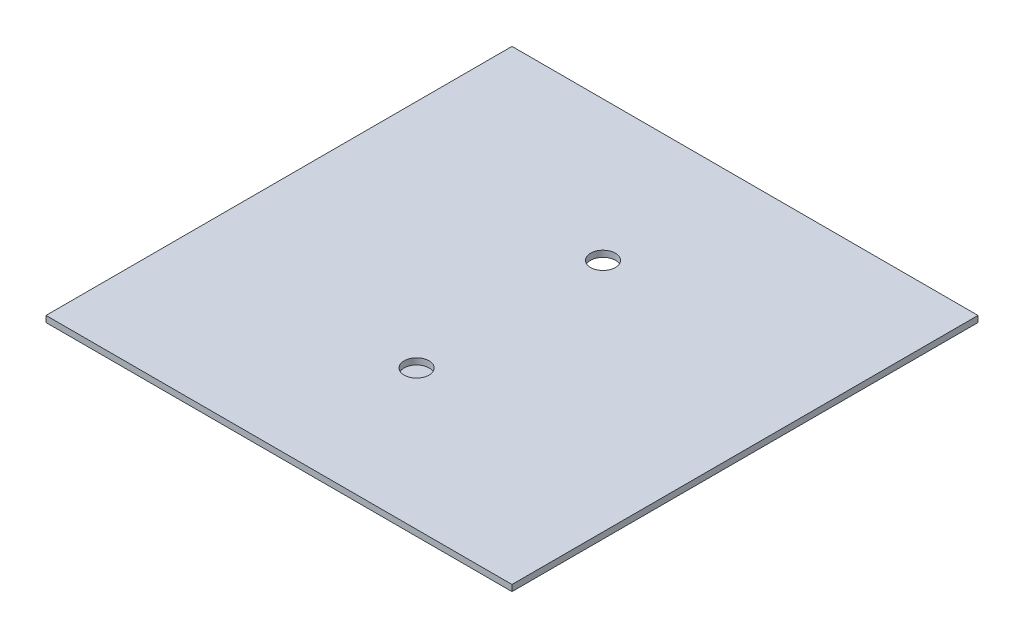
ISO-10303-21;
HEADER;
FILE_DESCRIPTION(('STEP AP214'),'2;1');
FILE_NAME('part.step','',(''),(''),'','','');
FILE_SCHEMA(('AUTOMOTIVE_DESIGN { 1 0 10303 214 1 1 1 1 }'));
ENDSEC;
DATA;
#1=APPLICATION_CONTEXT('core data for automotive mechanical design processes');
#2=APPLICATION_PROTOCOL_DEFINITION('international standard','automotive_design',2000,#1);
#3=PRODUCT_CONTEXT('',#1,'mechanical');
#4=PRODUCT('Part','Part','',(#3));
#5=PRODUCT_RELATED_PRODUCT_CATEGORY('part','',(#4));
#6=PRODUCT_DEFINITION_FORMATION('','',#4);
#7=PRODUCT_DEFINITION_CONTEXT('part definition',#1,'design');
#8=PRODUCT_DEFINITION('design','',#6,#7);
#9=PRODUCT_DEFINITION_SHAPE('','',#8);
#10=(LENGTH_UNIT() NAMED_UNIT(*) SI_UNIT(.MILLI.,.METRE.));
#11=(NAMED_UNIT(*) PLANE_ANGLE_UNIT() SI_UNIT($,.RADIAN.));
#12=(NAMED_UNIT(*) SI_UNIT($,.STERADIAN.) SOLID_ANGLE_UNIT());
#13=UNCERTAINTY_MEASURE_WITH_UNIT(LENGTH_MEASURE(1.E-05),#10,'distance_accuracy_value','');
#14=(GEOMETRIC_REPRESENTATION_CONTEXT(3) GLOBAL_UNCERTAINTY_ASSIGNED_CONTEXT((#13)) GLOBAL_UNIT_ASSIGNED_CONTEXT((#10,
#11,#12)) REPRESENTATION_CONTEXT('',''));
#15=CARTESIAN_POINT('',(0.,0.,0.));
#16=DIRECTION('',(0.,0.,1.));
#17=DIRECTION('',(1.,0.,0.));
#18=AXIS2_PLACEMENT_3D('',#15,#16,#17);
#19=CARTESIAN_POINT('',(0.,2.,0.));
#20=DIRECTION('',(0.,1.,0.));
#21=DIRECTION('',(0.,0.,1.));
#22=AXIS2_PLACEMENT_3D('',#19,#20,#21);
#23=PLANE('',#22);
#24=CARTESIAN_POINT('',(0.,2.,0.));
#25=DIRECTION('',(0.,1.,0.));
#26=DIRECTION('',(0.,0.,1.));
#27=AXIS2_PLACEMENT_3D('',#24,#25,#26);
#28=CIRCLE('',#27,40.);
#29=CARTESIAN_POINT('',(-39.2905841137543,2.,-7.49999999999999));
#30=VERTEX_POINT('',#29);
#31=CARTESIAN_POINT('',(-39.2905841137543,2.,7.50000000000001));
#32=VERTEX_POINT('',#31);
#33=EDGE_CURVE('E332',#30,#32,#28,.T.);
#34=ORIENTED_EDGE('',*,*,#33,.T.);
#35=DIRECTION('',(0.,0.,-1.));
#36=VECTOR('',#35,1.);
#37=CARTESIAN_POINT('',(-39.2905841137543,2.,0.));
#38=LINE('',#37,#36);
#39=EDGE_CURVE('E287',#32,#30,#38,.T.);
#40=ORIENTED_EDGE('',*,*,#39,.T.);
#41=EDGE_LOOP('',(#34,#40));
#42=FACE_BOUND('',#41,.T.);
#43=ADVANCED_FACE('F43',(#42),#23,.T.);
#44=CARTESIAN_POINT('',(0.,2.,0.));
#45=DIRECTION('',(0.,-1.,0.));
#46=DIRECTION('',(0.,0.,-1.));
#47=AXIS2_PLACEMENT_3D('',#44,#45,#46);
#48=CYLINDRICAL_SURFACE('',#47,40.);
#49=ORIENTED_EDGE('',*,*,#33,.F.);
#50=CARTESIAN_POINT('',(27.5,2.,-29.0473750965556));
#51=VERTEX_POINT('',#50);
#52=EDGE_CURVE('E338',#51,#30,#28,.T.);
#53=ORIENTED_EDGE('',*,*,#52,.F.);
#54=CARTESIAN_POINT('',(27.5,2.,29.0473750965556));
#55=VERTEX_POINT('',#54);
#56=EDGE_CURVE('E449',#55,#51,#28,.T.);
#57=ORIENTED_EDGE('',*,*,#56,.F.);
#58=EDGE_CURVE('E337',#32,#55,#28,.T.);
#59=ORIENTED_EDGE('',*,*,#58,.F.);
#60=EDGE_LOOP('',(#49,#53,#57,#59));
#61=FACE_BOUND('',#60,.T.);
#62=CARTESIAN_POINT('',(0.,0.,0.));
#63=DIRECTION('',(0.,1.,0.));
#64=DIRECTION('',(0.,0.,1.));
#65=AXIS2_PLACEMENT_3D('',#62,#63,#64);
#66=CIRCLE('',#65,40.);
#67=CARTESIAN_POINT('',(0.,0.,40.));
#68=VERTEX_POINT('',#67);
#69=EDGE_CURVE('E339',#68,#68,#66,.T.);
#70=ORIENTED_EDGE('',*,*,#69,.T.);
#71=EDGE_LOOP('',(#70));
#72=FACE_BOUND('',#71,.T.);
#73=ADVANCED_FACE('F472',(#61,#72),#48,.T.);
#74=DIRECTION('',(0.,0.,-1.));
#75=VECTOR('',#74,1.);
#76=CARTESIAN_POINT('',(12.5,2.,-14.0473750965556));
#77=LINE('',#76,#75);
#78=CARTESIAN_POINT('',(12.5,2.,-14.0473750965556));
#79=VERTEX_POINT('',#78);
#80=CARTESIAN_POINT('',(12.5,2.,-29.0473750965556));
#81=VERTEX_POINT('',#80);
#82=EDGE_CURVE('E249',#79,#81,#77,.T.);
#83=ORIENTED_EDGE('',*,*,#82,.T.);
#84=DIRECTION('',(1.,0.,0.));
#85=VECTOR('',#84,1.);
#86=CARTESIAN_POINT('',(12.5,2.,-29.0473750965556));
#87=LINE('',#86,#85);
#88=EDGE_CURVE('E245',#81,#51,#87,.T.);
#89=ORIENTED_EDGE('',*,*,#88,.T.);
#90=ORIENTED_EDGE('',*,*,#52,.T.);
#91=DIRECTION('',(-1.,0.,0.));
#92=VECTOR('',#91,1.);
#93=CARTESIAN_POINT('',(0.,2.,-7.5));
#94=LINE('',#93,#92);
#95=CARTESIAN_POINT('',(-24.2905841137543,2.,-7.49999999999999));
#96=VERTEX_POINT('',#95);
#97=EDGE_CURVE('E296',#96,#30,#94,.T.);
#98=ORIENTED_EDGE('',*,*,#97,.F.);
#99=DIRECTION('',(0.,0.,-1.));
#100=VECTOR('',#99,1.);
#101=CARTESIAN_POINT('',(-24.2905841137543,2.,0.));
#102=LINE('',#101,#100);
#103=CARTESIAN_POINT('',(-24.2905841137543,2.,7.50000000000001));
#104=VERTEX_POINT('',#103);
#105=EDGE_CURVE('E304',#104,#96,#102,.T.);
#106=ORIENTED_EDGE('',*,*,#105,.F.);
#107=DIRECTION('',(-1.,0.,0.));
#108=VECTOR('',#107,1.);
#109=CARTESIAN_POINT('',(0.,2.,7.5));
#110=LINE('',#109,#108);
#111=EDGE_CURVE('E300',#104,#32,#110,.T.);
#112=ORIENTED_EDGE('',*,*,#111,.T.);
#113=ORIENTED_EDGE('',*,*,#58,.T.);
#114=DIRECTION('',(1.,0.,0.));
#115=VECTOR('',#114,1.);
#116=CARTESIAN_POINT('',(0.,2.,29.0473750965556));
#117=LINE('',#116,#115);
#118=CARTESIAN_POINT('',(12.5,2.,29.0473750965556));
#119=VERTEX_POINT('',#118);
#120=EDGE_CURVE('E270',#119,#55,#117,.T.);
#121=ORIENTED_EDGE('',*,*,#120,.F.);
#122=DIRECTION('',(0.,0.,1.));
#123=VECTOR('',#122,1.);
#124=CARTESIAN_POINT('',(12.5,2.,0.));
#125=LINE('',#124,#123);
#126=CARTESIAN_POINT('',(12.5,2.,14.0473750965556));
#127=VERTEX_POINT('',#126);
#128=EDGE_CURVE('E274',#127,#119,#125,.T.);
#129=ORIENTED_EDGE('',*,*,#128,.F.);
#130=DIRECTION('',(1.,0.,0.));
#131=VECTOR('',#130,1.);
#132=CARTESIAN_POINT('',(0.,2.,14.0473750965556));
#133=LINE('',#132,#131);
#134=CARTESIAN_POINT('',(27.5,2.,14.0473750965556));
#135=VERTEX_POINT('',#134);
#136=EDGE_CURVE('E279',#127,#135,#133,.T.);
#137=ORIENTED_EDGE('',*,*,#136,.T.);
#138=DIRECTION('',(0.,0.,1.));
#139=VECTOR('',#138,1.);
#140=CARTESIAN_POINT('',(27.5,2.,0.));
#141=LINE('',#140,#139);
#142=EDGE_CURVE('E283',#135,#55,#141,.T.);
#143=ORIENTED_EDGE('',*,*,#142,.T.);
#144=ORIENTED_EDGE('',*,*,#56,.T.);
#145=DIRECTION('',(0.,0.,-1.));
#146=VECTOR('',#145,1.);
#147=CARTESIAN_POINT('',(27.5,2.,-14.0473750965556));
#148=LINE('',#147,#146);
#149=CARTESIAN_POINT('',(27.5,2.,-14.0473750965556));
#150=VERTEX_POINT('',#149);
#151=EDGE_CURVE('E240',#150,#51,#148,.T.);
#152=ORIENTED_EDGE('',*,*,#151,.F.);
#153=DIRECTION('',(1.,0.,0.));
#154=VECTOR('',#153,1.);
#155=CARTESIAN_POINT('',(12.5,2.,-14.0473750965556));
#156=LINE('',#155,#154);
#157=EDGE_CURVE('E236',#79,#150,#156,.T.);
#158=ORIENTED_EDGE('',*,*,#157,.F.);
#159=EDGE_LOOP('',(#83,#89,#90,#98,#106,#112,#113,#121,#129,#137,#143,#144,#152,#158));
#160=FACE_BOUND('',#159,.T.);
#161=CARTESIAN_POINT('',(0.,2.,-30.));
#162=DIRECTION('',(0.,1.,0.));
#163=DIRECTION('',(0.,0.,1.));
#164=AXIS2_PLACEMENT_3D('',#161,#162,#163);
#165=CIRCLE('',#164,2.);
#166=CARTESIAN_POINT('',(0.,2.,-28.));
#167=VERTEX_POINT('',#166);
#168=EDGE_CURVE('E322',#167,#167,#165,.T.);
#169=ORIENTED_EDGE('',*,*,#168,.F.);
#170=EDGE_LOOP('',(#169));
#171=FACE_BOUND('',#170,.T.);
#172=CARTESIAN_POINT('',(0.,2.,30.));
#173=DIRECTION('',(0.,1.,0.));
#174=DIRECTION('',(0.,0.,1.));
#175=AXIS2_PLACEMENT_3D('',#172,#173,#174);
#176=CIRCLE('',#175,2.);
#177=CARTESIAN_POINT('',(0.,2.,32.));
#178=VERTEX_POINT('',#177);
#179=EDGE_CURVE('E327',#178,#178,#176,.T.);
#180=ORIENTED_EDGE('',*,*,#179,.F.);
#181=EDGE_LOOP('',(#180));
#182=FACE_BOUND('',#181,.T.);
#183=ADVANCED_FACE('F446',(#160,#171,#182),#23,.T.);
#184=CARTESIAN_POINT('',(0.,0.,0.));
#185=DIRECTION('',(0.,1.,0.));
#186=DIRECTION('',(0.,0.,1.));
#187=AXIS2_PLACEMENT_3D('',#184,#185,#186);
#188=PLANE('',#187);
#189=CARTESIAN_POINT('',(0.,0.,-30.));
#190=DIRECTION('',(0.,1.,0.));
#191=DIRECTION('',(0.,0.,1.));
#192=AXIS2_PLACEMENT_3D('',#189,#190,#191);
#193=CIRCLE('',#192,2.);
#194=CARTESIAN_POINT('',(0.,0.,-28.));
#195=VERTEX_POINT('',#194);
#196=EDGE_CURVE('E326',#195,#195,#193,.T.);
#197=ORIENTED_EDGE('',*,*,#196,.T.);
#198=EDGE_LOOP('',(#197));
#199=FACE_BOUND('',#198,.T.);
#200=CARTESIAN_POINT('',(0.,0.,30.));
#201=DIRECTION('',(0.,1.,0.));
#202=DIRECTION('',(0.,0.,1.));
#203=AXIS2_PLACEMENT_3D('',#200,#201,#202);
#204=CIRCLE('',#203,2.);
#205=CARTESIAN_POINT('',(0.,0.,32.));
#206=VERTEX_POINT('',#205);
#207=EDGE_CURVE('E331',#206,#206,#204,.T.);
#208=ORIENTED_EDGE('',*,*,#207,.T.);
#209=EDGE_LOOP('',(#208));
#210=FACE_BOUND('',#209,.T.);
#211=ORIENTED_EDGE('',*,*,#69,.F.);
#212=EDGE_LOOP('',(#211));
#213=FACE_BOUND('',#212,.T.);
#214=ADVANCED_FACE('F530',(#199,#210,#213),#188,.F.);
#215=CARTESIAN_POINT('',(0.,2.,30.));
#216=DIRECTION('',(0.,1.,0.));
#217=DIRECTION('',(0.,0.,1.));
#218=AXIS2_PLACEMENT_3D('',#215,#216,#217);
#219=CYLINDRICAL_SURFACE('',#218,2.);
#220=ORIENTED_EDGE('',*,*,#179,.T.);
#221=EDGE_LOOP('',(#220));
#222=FACE_BOUND('',#221,.T.);
#223=ORIENTED_EDGE('',*,*,#207,.F.);
#224=EDGE_LOOP('',(#223));
#225=FACE_BOUND('',#224,.T.);
#226=ADVANCED_FACE('F534',(#222,#225),#219,.F.);
#227=CARTESIAN_POINT('',(0.,2.,-30.));
#228=DIRECTION('',(0.,1.,0.));
#229=DIRECTION('',(0.,0.,1.));
#230=AXIS2_PLACEMENT_3D('',#227,#228,#229);
#231=CYLINDRICAL_SURFACE('',#230,2.);
#232=ORIENTED_EDGE('',*,*,#168,.T.);
#233=EDGE_LOOP('',(#232));
#234=FACE_BOUND('',#233,.T.);
#235=ORIENTED_EDGE('',*,*,#196,.F.);
#236=EDGE_LOOP('',(#235));
#237=FACE_BOUND('',#236,.T.);
#238=ADVANCED_FACE('F539',(#234,#237),#231,.F.);
#239=CARTESIAN_POINT('',(-39.2905841137543,22.,0.));
#240=DIRECTION('',(-1.,0.,0.));
#241=DIRECTION('',(0.,0.,1.));
#242=AXIS2_PLACEMENT_3D('',#239,#240,#241);
#243=PLANE('',#242);
#244=DIRECTION('',(0.,-1.,0.));
#245=VECTOR('',#244,1.);
#246=CARTESIAN_POINT('',(-39.2905841137543,22.,7.50000000000001));
#247=LINE('',#246,#245);
#248=CARTESIAN_POINT('',(-39.2905841137543,17.,7.50000000000001));
#249=VERTEX_POINT('',#248);
#250=EDGE_CURVE('E319',#249,#32,#247,.T.);
#251=ORIENTED_EDGE('',*,*,#250,.F.);
#252=DIRECTION('',(0.,0.,-1.));
#253=VECTOR('',#252,1.);
#254=CARTESIAN_POINT('',(-39.2905841137543,17.,0.));
#255=LINE('',#254,#253);
#256=CARTESIAN_POINT('',(-39.2905841137543,17.,-7.49999999999999));
#257=VERTEX_POINT('',#256);
#258=EDGE_CURVE('E378',#249,#257,#255,.T.);
#259=ORIENTED_EDGE('',*,*,#258,.T.);
#260=DIRECTION('',(0.,-1.,0.));
#261=VECTOR('',#260,1.);
#262=CARTESIAN_POINT('',(-39.2905841137543,22.,-7.49999999999999));
#263=LINE('',#262,#261);
#264=EDGE_CURVE('E295',#257,#30,#263,.T.);
#265=ORIENTED_EDGE('',*,*,#264,.T.);
#266=ORIENTED_EDGE('',*,*,#39,.F.);
#267=EDGE_LOOP('',(#251,#259,#265,#266));
#268=FACE_BOUND('',#267,.T.);
#269=ADVANCED_FACE('F482',(#268),#243,.T.);
#270=CARTESIAN_POINT('',(0.,22.,7.5));
#271=DIRECTION('',(0.,0.,1.));
#272=DIRECTION('',(1.,0.,0.));
#273=AXIS2_PLACEMENT_3D('',#270,#271,#272);
#274=PLANE('',#273);
#275=DIRECTION('',(0.,-1.,0.));
#276=VECTOR('',#275,1.);
#277=CARTESIAN_POINT('',(-24.2905841137543,22.,7.50000000000001));
#278=LINE('',#277,#276);
#279=CARTESIAN_POINT('',(-24.2905841137543,17.,7.50000000000001));
#280=VERTEX_POINT('',#279);
#281=EDGE_CURVE('E316',#280,#104,#278,.T.);
#282=ORIENTED_EDGE('',*,*,#281,.F.);
#283=DIRECTION('',(-1.,0.,0.));
#284=VECTOR('',#283,1.);
#285=CARTESIAN_POINT('',(0.,17.,7.5));
#286=LINE('',#285,#284);
#287=EDGE_CURVE('E381',#280,#249,#286,.T.);
#288=ORIENTED_EDGE('',*,*,#287,.T.);
#289=ORIENTED_EDGE('',*,*,#250,.T.);
#290=ORIENTED_EDGE('',*,*,#111,.F.);
#291=EDGE_LOOP('',(#282,#288,#289,#290));
#292=FACE_BOUND('',#291,.T.);
#293=ADVANCED_FACE('F479',(#292),#274,.T.);
#294=CARTESIAN_POINT('',(-24.2905841137543,22.,0.));
#295=DIRECTION('',(-1.,0.,0.));
#296=DIRECTION('',(0.,0.,1.));
#297=AXIS2_PLACEMENT_3D('',#294,#295,#296);
#298=PLANE('',#297);
#299=ORIENTED_EDGE('',*,*,#105,.T.);
#300=DIRECTION('',(0.,-1.,0.));
#301=VECTOR('',#300,1.);
#302=CARTESIAN_POINT('',(-24.2905841137543,22.,-7.49999999999999));
#303=LINE('',#302,#301);
#304=CARTESIAN_POINT('',(-24.2905841137543,17.,-7.49999999999999));
#305=VERTEX_POINT('',#304);
#306=EDGE_CURVE('E313',#305,#96,#303,.T.);
#307=ORIENTED_EDGE('',*,*,#306,.F.);
#308=CARTESIAN_POINT('',(-24.2905841137543,17.,-12.5));
#309=DIRECTION('',(-1.,0.,0.));
#310=DIRECTION('',(0.,0.,1.));
#311=AXIS2_PLACEMENT_3D('',#308,#309,#310);
#312=CIRCLE('',#311,5.);
#313=CARTESIAN_POINT('',(-24.2905841137543,22.,-12.5));
#314=VERTEX_POINT('',#313);
#315=EDGE_CURVE('E395',#305,#314,#312,.T.);
#316=ORIENTED_EDGE('',*,*,#315,.T.);
#317=DIRECTION('',(0.,0.,-1.));
#318=VECTOR('',#317,1.);
#319=CARTESIAN_POINT('',(-24.2905841137543,22.,0.));
#320=LINE('',#319,#318);
#321=CARTESIAN_POINT('',(-24.2905841137543,22.,12.5));
#322=VERTEX_POINT('',#321);
#323=EDGE_CURVE('E292',#322,#314,#320,.T.);
#324=ORIENTED_EDGE('',*,*,#323,.F.);
#325=CARTESIAN_POINT('',(-24.2905841137543,17.,12.5));
#326=DIRECTION('',(-1.,0.,0.));
#327=DIRECTION('',(0.,0.,1.));
#328=AXIS2_PLACEMENT_3D('',#325,#326,#327);
#329=CIRCLE('',#328,5.);
#330=EDGE_CURVE('E399',#322,#280,#329,.T.);
#331=ORIENTED_EDGE('',*,*,#330,.T.);
#332=ORIENTED_EDGE('',*,*,#281,.T.);
#333=EDGE_LOOP('',(#299,#307,#316,#324,#331,#332));
#334=FACE_BOUND('',#333,.T.);
#335=ADVANCED_FACE('F497',(#334),#298,.F.);
#336=CARTESIAN_POINT('',(0.,22.,-7.5));
#337=DIRECTION('',(0.,0.,1.));
#338=DIRECTION('',(1.,0.,0.));
#339=AXIS2_PLACEMENT_3D('',#336,#337,#338);
#340=PLANE('',#339);
#341=ORIENTED_EDGE('',*,*,#264,.F.);
#342=DIRECTION('',(-1.,0.,0.));
#343=VECTOR('',#342,1.);
#344=CARTESIAN_POINT('',(-24.2905841137543,17.,-7.49999999999999));
#345=LINE('',#344,#343);
#346=EDGE_CURVE('E375',#257,#305,#345,.F.);
#347=ORIENTED_EDGE('',*,*,#346,.T.);
#348=ORIENTED_EDGE('',*,*,#306,.T.);
#349=ORIENTED_EDGE('',*,*,#97,.T.);
#350=EDGE_LOOP('',(#341,#347,#348,#349));
#351=FACE_BOUND('',#350,.T.);
#352=ADVANCED_FACE('F465',(#351),#340,.F.);
#353=CARTESIAN_POINT('',(27.5,22.,0.));
#354=DIRECTION('',(1.,0.,0.));
#355=DIRECTION('',(0.,0.,-1.));
#356=AXIS2_PLACEMENT_3D('',#353,#354,#355);
#357=PLANE('',#356);
#358=DIRECTION('',(0.,-1.,0.));
#359=VECTOR('',#358,1.);
#360=CARTESIAN_POINT('',(27.5,22.,14.0473750965556));
#361=LINE('',#360,#359);
#362=CARTESIAN_POINT('',(27.5,17.,14.0473750965556));
#363=VERTEX_POINT('',#362);
#364=EDGE_CURVE('E253',#363,#135,#361,.T.);
#365=ORIENTED_EDGE('',*,*,#364,.F.);
#366=DIRECTION('',(0.,0.,1.));
#367=VECTOR('',#366,1.);
#368=CARTESIAN_POINT('',(27.5,17.,0.));
#369=LINE('',#368,#367);
#370=CARTESIAN_POINT('',(27.5,17.,29.0473750965556));
#371=VERTEX_POINT('',#370);
#372=EDGE_CURVE('E387',#363,#371,#369,.T.);
#373=ORIENTED_EDGE('',*,*,#372,.T.);
#374=DIRECTION('',(0.,-1.,0.));
#375=VECTOR('',#374,1.);
#376=CARTESIAN_POINT('',(27.5,22.,29.0473750965556));
#377=LINE('',#376,#375);
#378=EDGE_CURVE('E266',#371,#55,#377,.T.);
#379=ORIENTED_EDGE('',*,*,#378,.T.);
#380=ORIENTED_EDGE('',*,*,#142,.F.);
#381=EDGE_LOOP('',(#365,#373,#379,#380));
#382=FACE_BOUND('',#381,.T.);
#383=ADVANCED_FACE('F588',(#382),#357,.T.);
#384=CARTESIAN_POINT('',(0.,22.,14.0473750965556));
#385=DIRECTION('',(0.,0.,-1.));
#386=DIRECTION('',(-1.,0.,0.));
#387=AXIS2_PLACEMENT_3D('',#384,#385,#386);
#388=PLANE('',#387);
#389=ORIENTED_EDGE('',*,*,#136,.F.);
#390=DIRECTION('',(0.,-1.,0.));
#391=VECTOR('',#390,1.);
#392=CARTESIAN_POINT('',(12.5,22.,14.0473750965556));
#393=LINE('',#392,#391);
#394=CARTESIAN_POINT('',(12.5,22.,14.0473750965556));
#395=VERTEX_POINT('',#394);
#396=EDGE_CURVE('E260',#395,#127,#393,.T.);
#397=ORIENTED_EDGE('',*,*,#396,.F.);
#398=DIRECTION('',(1.,0.,0.));
#399=VECTOR('',#398,1.);
#400=CARTESIAN_POINT('',(0.,22.,14.0473750965556));
#401=LINE('',#400,#399);
#402=CARTESIAN_POINT('',(32.5,22.,14.0473750965556));
#403=VERTEX_POINT('',#402);
#404=EDGE_CURVE('E275',#395,#403,#401,.T.);
#405=ORIENTED_EDGE('',*,*,#404,.T.);
#406=CARTESIAN_POINT('',(32.5,17.,14.0473750965556));
#407=DIRECTION('',(0.,0.,-1.));
#408=DIRECTION('',(-1.,0.,0.));
#409=AXIS2_PLACEMENT_3D('',#406,#407,#408);
#410=CIRCLE('',#409,5.);
#411=EDGE_CURVE('E406',#403,#363,#410,.F.);
#412=ORIENTED_EDGE('',*,*,#411,.T.);
#413=ORIENTED_EDGE('',*,*,#364,.T.);
#414=EDGE_LOOP('',(#389,#397,#405,#412,#413));
#415=FACE_BOUND('',#414,.T.);
#416=ADVANCED_FACE('F591',(#415),#388,.T.);
#417=CARTESIAN_POINT('',(12.5,22.,0.));
#418=DIRECTION('',(1.,0.,0.));
#419=DIRECTION('',(0.,0.,-1.));
#420=AXIS2_PLACEMENT_3D('',#417,#418,#419);
#421=PLANE('',#420);
#422=ORIENTED_EDGE('',*,*,#128,.T.);
#423=DIRECTION('',(0.,-1.,0.));
#424=VECTOR('',#423,1.);
#425=CARTESIAN_POINT('',(12.5,22.,29.0473750965556));
#426=LINE('',#425,#424);
#427=CARTESIAN_POINT('',(12.5,17.,29.0473750965556));
#428=VERTEX_POINT('',#427);
#429=EDGE_CURVE('E263',#428,#119,#426,.T.);
#430=ORIENTED_EDGE('',*,*,#429,.F.);
#431=CARTESIAN_POINT('',(12.5,17.,34.0473750965556));
#432=DIRECTION('',(1.,0.,0.));
#433=DIRECTION('',(0.,0.,-1.));
#434=AXIS2_PLACEMENT_3D('',#431,#432,#433);
#435=CIRCLE('',#434,5.);
#436=CARTESIAN_POINT('',(12.5,22.,34.0473750965556));
#437=VERTEX_POINT('',#436);
#438=EDGE_CURVE('E402',#428,#437,#435,.T.);
#439=ORIENTED_EDGE('',*,*,#438,.T.);
#440=DIRECTION('',(0.,0.,1.));
#441=VECTOR('',#440,1.);
#442=CARTESIAN_POINT('',(12.5,22.,0.));
#443=LINE('',#442,#441);
#444=EDGE_CURVE('E269',#395,#437,#443,.T.);
#445=ORIENTED_EDGE('',*,*,#444,.F.);
#446=ORIENTED_EDGE('',*,*,#396,.T.);
#447=EDGE_LOOP('',(#422,#430,#439,#445,#446));
#448=FACE_BOUND('',#447,.T.);
#449=ADVANCED_FACE('F509',(#448),#421,.F.);
#450=CARTESIAN_POINT('',(0.,22.,29.0473750965556));
#451=DIRECTION('',(0.,0.,-1.));
#452=DIRECTION('',(-1.,0.,0.));
#453=AXIS2_PLACEMENT_3D('',#450,#451,#452);
#454=PLANE('',#453);
#455=ORIENTED_EDGE('',*,*,#378,.F.);
#456=DIRECTION('',(1.,0.,0.));
#457=VECTOR('',#456,1.);
#458=CARTESIAN_POINT('',(12.5,17.,29.0473750965556));
#459=LINE('',#458,#457);
#460=EDGE_CURVE('E384',#371,#428,#459,.F.);
#461=ORIENTED_EDGE('',*,*,#460,.T.);
#462=ORIENTED_EDGE('',*,*,#429,.T.);
#463=ORIENTED_EDGE('',*,*,#120,.T.);
#464=EDGE_LOOP('',(#455,#461,#462,#463));
#465=FACE_BOUND('',#464,.T.);
#466=ADVANCED_FACE('F580',(#465),#454,.F.);
#467=CARTESIAN_POINT('',(12.5,22.,-14.0473750965556));
#468=DIRECTION('',(-1.,0.,0.));
#469=DIRECTION('',(0.,0.,1.));
#470=AXIS2_PLACEMENT_3D('',#467,#468,#469);
#471=PLANE('',#470);
#472=ORIENTED_EDGE('',*,*,#82,.F.);
#473=DIRECTION('',(0.,-1.,0.));
#474=VECTOR('',#473,1.);
#475=CARTESIAN_POINT('',(12.5,22.,-14.0473750965556));
#476=LINE('',#475,#474);
#477=CARTESIAN_POINT('',(12.5,22.,-14.0473750965556));
#478=VERTEX_POINT('',#477);
#479=EDGE_CURVE('E216',#478,#79,#476,.T.);
#480=ORIENTED_EDGE('',*,*,#479,.F.);
#481=DIRECTION('',(0.,0.,-1.));
#482=VECTOR('',#481,1.);
#483=CARTESIAN_POINT('',(12.5,22.,-14.0473750965556));
#484=LINE('',#483,#482);
#485=CARTESIAN_POINT('',(12.5,22.,-34.0473750965556));
#486=VERTEX_POINT('',#485);
#487=EDGE_CURVE('E241',#478,#486,#484,.T.);
#488=ORIENTED_EDGE('',*,*,#487,.T.);
#489=CARTESIAN_POINT('',(12.5,17.,-34.0473750965556));
#490=DIRECTION('',(-1.,0.,0.));
#491=DIRECTION('',(0.,0.,1.));
#492=AXIS2_PLACEMENT_3D('',#489,#490,#491);
#493=CIRCLE('',#492,5.);
#494=CARTESIAN_POINT('',(12.5,17.,-29.0473750965556));
#495=VERTEX_POINT('',#494);
#496=EDGE_CURVE('E11',#486,#495,#493,.F.);
#497=ORIENTED_EDGE('',*,*,#496,.T.);
#498=DIRECTION('',(0.,-1.,0.));
#499=VECTOR('',#498,1.);
#500=CARTESIAN_POINT('',(12.5,22.,-29.0473750965556));
#501=LINE('',#500,#499);
#502=EDGE_CURVE('E227',#495,#81,#501,.T.);
#503=ORIENTED_EDGE('',*,*,#502,.T.);
#504=EDGE_LOOP('',(#472,#480,#488,#497,#503));
#505=FACE_BOUND('',#504,.T.);
#506=ADVANCED_FACE('F577',(#505),#471,.T.);
#507=CARTESIAN_POINT('',(12.5,22.,-14.0473750965556));
#508=DIRECTION('',(0.,0.,-1.));
#509=DIRECTION('',(-1.,0.,0.));
#510=AXIS2_PLACEMENT_3D('',#507,#508,#509);
#511=PLANE('',#510);
#512=ORIENTED_EDGE('',*,*,#157,.T.);
#513=DIRECTION('',(0.,-1.,0.));
#514=VECTOR('',#513,1.);
#515=CARTESIAN_POINT('',(27.5,22.,-14.0473750965556));
#516=LINE('',#515,#514);
#517=CARTESIAN_POINT('',(27.5,17.,-14.0473750965556));
#518=VERTEX_POINT('',#517);
#519=EDGE_CURVE('E221',#518,#150,#516,.T.);
#520=ORIENTED_EDGE('',*,*,#519,.F.);
#521=CARTESIAN_POINT('',(32.5,17.,-14.0473750965556));
#522=DIRECTION('',(0.,0.,-1.));
#523=DIRECTION('',(-1.,0.,0.));
#524=AXIS2_PLACEMENT_3D('',#521,#522,#523);
#525=CIRCLE('',#524,5.);
#526=CARTESIAN_POINT('',(32.5,22.,-14.0473750965556));
#527=VERTEX_POINT('',#526);
#528=EDGE_CURVE('E53',#518,#527,#525,.T.);
#529=ORIENTED_EDGE('',*,*,#528,.T.);
#530=DIRECTION('',(1.,0.,0.));
#531=VECTOR('',#530,1.);
#532=CARTESIAN_POINT('',(12.5,22.,-14.0473750965556));
#533=LINE('',#532,#531);
#534=EDGE_CURVE('E230',#478,#527,#533,.T.);
#535=ORIENTED_EDGE('',*,*,#534,.F.);
#536=ORIENTED_EDGE('',*,*,#479,.T.);
#537=EDGE_LOOP('',(#512,#520,#529,#535,#536));
#538=FACE_BOUND('',#537,.T.);
#539=ADVANCED_FACE('F441',(#538),#511,.F.);
#540=CARTESIAN_POINT('',(27.5,22.,-14.0473750965556));
#541=DIRECTION('',(-1.,0.,0.));
#542=DIRECTION('',(0.,0.,1.));
#543=AXIS2_PLACEMENT_3D('',#540,#541,#542);
#544=PLANE('',#543);
#545=DIRECTION('',(0.,-1.,0.));
#546=VECTOR('',#545,1.);
#547=CARTESIAN_POINT('',(27.5,22.,-29.0473750965556));
#548=LINE('',#547,#546);
#549=CARTESIAN_POINT('',(27.5,17.,-29.0473750965556));
#550=VERTEX_POINT('',#549);
#551=EDGE_CURVE('E231',#550,#51,#548,.T.);
#552=ORIENTED_EDGE('',*,*,#551,.F.);
#553=DIRECTION('',(0.,0.,-1.));
#554=VECTOR('',#553,1.);
#555=CARTESIAN_POINT('',(27.5,17.,-14.0473750965556));
#556=LINE('',#555,#554);
#557=EDGE_CURVE('E67',#550,#518,#556,.F.);
#558=ORIENTED_EDGE('',*,*,#557,.T.);
#559=ORIENTED_EDGE('',*,*,#519,.T.);
#560=ORIENTED_EDGE('',*,*,#151,.T.);
#561=EDGE_LOOP('',(#552,#558,#559,#560));
#562=FACE_BOUND('',#561,.T.);
#563=ADVANCED_FACE('F443',(#562),#544,.F.);
#564=CARTESIAN_POINT('',(12.5,22.,-29.0473750965556));
#565=DIRECTION('',(0.,0.,-1.));
#566=DIRECTION('',(-1.,0.,0.));
#567=AXIS2_PLACEMENT_3D('',#564,#565,#566);
#568=PLANE('',#567);
#569=ORIENTED_EDGE('',*,*,#502,.F.);
#570=DIRECTION('',(1.,0.,0.));
#571=VECTOR('',#570,1.);
#572=CARTESIAN_POINT('',(12.5,17.,-29.0473750965556));
#573=LINE('',#572,#571);
#574=EDGE_CURVE('E392',#495,#550,#573,.T.);
#575=ORIENTED_EDGE('',*,*,#574,.T.);
#576=ORIENTED_EDGE('',*,*,#551,.T.);
#577=ORIENTED_EDGE('',*,*,#88,.F.);
#578=EDGE_LOOP('',(#569,#575,#576,#577));
#579=FACE_BOUND('',#578,.T.);
#580=ADVANCED_FACE('F576',(#579),#568,.T.);
#581=CARTESIAN_POINT('',(-74.2905841137543,24.,-74.9978750965556));
#582=DIRECTION('',(1.,0.,0.));
#583=DIRECTION('',(0.,0.,-1.));
#584=AXIS2_PLACEMENT_3D('',#581,#582,#583);
#585=PLANE('',#584);
#586=DIRECTION('',(0.,0.,1.));
#587=VECTOR('',#586,1.);
#588=CARTESIAN_POINT('',(-74.2905841137543,22.,-74.9978750965556));
#589=LINE('',#588,#587);
#590=CARTESIAN_POINT('',(-74.2905841137543,22.,-74.9978750965556));
#591=VERTEX_POINT('',#590);
#592=CARTESIAN_POINT('',(-74.2905841137543,22.,75.0021249034444));
#593=VERTEX_POINT('',#592);
#594=EDGE_CURVE('E214',#591,#593,#589,.T.);
#595=ORIENTED_EDGE('',*,*,#594,.T.);
#596=DIRECTION('',(0.,-1.,0.));
#597=VECTOR('',#596,1.);
#598=CARTESIAN_POINT('',(-74.2905841137543,24.,75.0021249034444));
#599=LINE('',#598,#597);
#600=CARTESIAN_POINT('',(-74.2905841137543,24.,75.0021249034444));
#601=VERTEX_POINT('',#600);
#602=EDGE_CURVE('E192',#601,#593,#599,.T.);
#603=ORIENTED_EDGE('',*,*,#602,.F.);
#604=DIRECTION('',(0.,0.,1.));
#605=VECTOR('',#604,1.);
#606=CARTESIAN_POINT('',(-74.2905841137543,24.,-74.9978750965556));
#607=LINE('',#606,#605);
#608=CARTESIAN_POINT('',(-74.2905841137543,24.,-74.9978750965556));
#609=VERTEX_POINT('',#608);
#610=EDGE_CURVE('E200',#609,#601,#607,.T.);
#611=ORIENTED_EDGE('',*,*,#610,.F.);
#612=DIRECTION('',(0.,-1.,0.));
#613=VECTOR('',#612,1.);
#614=CARTESIAN_POINT('',(-74.2905841137543,24.,-74.9978750965556));
#615=LINE('',#614,#613);
#616=EDGE_CURVE('E822',#609,#591,#615,.T.);
#617=ORIENTED_EDGE('',*,*,#616,.T.);
#618=EDGE_LOOP('',(#595,#603,#611,#617));
#619=FACE_BOUND('',#618,.T.);
#620=ADVANCED_FACE('F212',(#619),#585,.F.);
#621=CARTESIAN_POINT('',(-74.2905841137543,24.,75.0021249034444));
#622=DIRECTION('',(0.,0.,-1.));
#623=DIRECTION('',(-1.,0.,0.));
#624=AXIS2_PLACEMENT_3D('',#621,#622,#623);
#625=PLANE('',#624);
#626=DIRECTION('',(1.,0.,0.));
#627=VECTOR('',#626,1.);
#628=CARTESIAN_POINT('',(-74.2905841137543,22.,75.0021249034444));
#629=LINE('',#628,#627);
#630=CARTESIAN_POINT('',(75.7094158862457,22.,75.0021249034444));
#631=VERTEX_POINT('',#630);
#632=EDGE_CURVE('E819',#593,#631,#629,.T.);
#633=ORIENTED_EDGE('',*,*,#632,.T.);
#634=DIRECTION('',(0.,-1.,0.));
#635=VECTOR('',#634,1.);
#636=CARTESIAN_POINT('',(75.7094158862457,24.,75.0021249034444));
#637=LINE('',#636,#635);
#638=CARTESIAN_POINT('',(75.7094158862457,24.,75.0021249034444));
#639=VERTEX_POINT('',#638);
#640=EDGE_CURVE('E195',#639,#631,#637,.T.);
#641=ORIENTED_EDGE('',*,*,#640,.F.);
#642=DIRECTION('',(1.,0.,0.));
#643=VECTOR('',#642,1.);
#644=CARTESIAN_POINT('',(-74.2905841137543,24.,75.0021249034444));
#645=LINE('',#644,#643);
#646=EDGE_CURVE('E188',#601,#639,#645,.T.);
#647=ORIENTED_EDGE('',*,*,#646,.F.);
#648=ORIENTED_EDGE('',*,*,#602,.T.);
#649=EDGE_LOOP('',(#633,#641,#647,#648));
#650=FACE_BOUND('',#649,.T.);
#651=ADVANCED_FACE('F190',(#650),#625,.F.);
#652=CARTESIAN_POINT('',(75.7094158862457,24.,-74.9978750965556));
#653=DIRECTION('',(-1.,0.,0.));
#654=DIRECTION('',(0.,0.,1.));
#655=AXIS2_PLACEMENT_3D('',#652,#653,#654);
#656=PLANE('',#655);
#657=DIRECTION('',(0.,0.,-1.));
#658=VECTOR('',#657,1.);
#659=CARTESIAN_POINT('',(75.7094158862457,22.,-74.9978750965556));
#660=LINE('',#659,#658);
#661=CARTESIAN_POINT('',(75.7094158862457,22.,-74.9978750965556));
#662=VERTEX_POINT('',#661);
#663=EDGE_CURVE('E815',#631,#662,#660,.T.);
#664=ORIENTED_EDGE('',*,*,#663,.T.);
#665=DIRECTION('',(0.,-1.,0.));
#666=VECTOR('',#665,1.);
#667=CARTESIAN_POINT('',(75.7094158862457,24.,-74.9978750965556));
#668=LINE('',#667,#666);
#669=CARTESIAN_POINT('',(75.7094158862457,24.,-74.9978750965556));
#670=VERTEX_POINT('',#669);
#671=EDGE_CURVE('E223',#670,#662,#668,.T.);
#672=ORIENTED_EDGE('',*,*,#671,.F.);
#673=DIRECTION('',(0.,0.,-1.));
#674=VECTOR('',#673,1.);
#675=CARTESIAN_POINT('',(75.7094158862457,24.,-74.9978750965556));
#676=LINE('',#675,#674);
#677=EDGE_CURVE('E199',#639,#670,#676,.T.);
#678=ORIENTED_EDGE('',*,*,#677,.F.);
#679=ORIENTED_EDGE('',*,*,#640,.T.);
#680=EDGE_LOOP('',(#664,#672,#678,#679));
#681=FACE_BOUND('',#680,.T.);
#682=ADVANCED_FACE('F567',(#681),#656,.F.);
#683=CARTESIAN_POINT('',(-74.2905841137543,24.,-74.9978750965556));
#684=DIRECTION('',(0.,0.,1.));
#685=DIRECTION('',(1.,0.,0.));
#686=AXIS2_PLACEMENT_3D('',#683,#684,#685);
#687=PLANE('',#686);
#688=DIRECTION('',(-1.,0.,0.));
#689=VECTOR('',#688,1.);
#690=CARTESIAN_POINT('',(-74.2905841137543,22.,-74.9978750965556));
#691=LINE('',#690,#689);
#692=EDGE_CURVE('E210',#662,#591,#691,.T.);
#693=ORIENTED_EDGE('',*,*,#692,.T.);
#694=ORIENTED_EDGE('',*,*,#616,.F.);
#695=DIRECTION('',(-1.,0.,0.));
#696=VECTOR('',#695,1.);
#697=CARTESIAN_POINT('',(-74.2905841137543,24.,-74.9978750965556));
#698=LINE('',#697,#696);
#699=EDGE_CURVE('E205',#670,#609,#698,.T.);
#700=ORIENTED_EDGE('',*,*,#699,.F.);
#701=ORIENTED_EDGE('',*,*,#671,.T.);
#702=EDGE_LOOP('',(#693,#694,#700,#701));
#703=FACE_BOUND('',#702,.T.);
#704=ADVANCED_FACE('F562',(#703),#687,.F.);
#705=CARTESIAN_POINT('',(0.,24.,0.));
#706=DIRECTION('',(0.,1.,0.));
#707=DIRECTION('',(0.,0.,1.));
#708=AXIS2_PLACEMENT_3D('',#705,#706,#707);
#709=PLANE('',#708);
#710=CARTESIAN_POINT('',(0.,24.,30.));
#711=DIRECTION('',(0.,-1.,0.));
#712=DIRECTION('',(0.,0.,-1.));
#713=AXIS2_PLACEMENT_3D('',#710,#711,#712);
#714=CIRCLE('',#713,4.);
#715=CARTESIAN_POINT('',(0.,24.,26.));
#716=VERTEX_POINT('',#715);
#717=EDGE_CURVE('E834',#716,#716,#714,.T.);
#718=ORIENTED_EDGE('',*,*,#717,.T.);
#719=EDGE_LOOP('',(#718));
#720=FACE_BOUND('',#719,.T.);
#721=CARTESIAN_POINT('',(0.,24.,-30.));
#722=DIRECTION('',(0.,-1.,0.));
#723=DIRECTION('',(0.,0.,-1.));
#724=AXIS2_PLACEMENT_3D('',#721,#722,#723);
#725=CIRCLE('',#724,4.);
#726=CARTESIAN_POINT('',(0.,24.,-34.));
#727=VERTEX_POINT('',#726);
#728=EDGE_CURVE('E843',#727,#727,#725,.T.);
#729=ORIENTED_EDGE('',*,*,#728,.T.);
#730=EDGE_LOOP('',(#729));
#731=FACE_BOUND('',#730,.T.);
#732=ORIENTED_EDGE('',*,*,#610,.T.);
#733=ORIENTED_EDGE('',*,*,#646,.T.);
#734=ORIENTED_EDGE('',*,*,#677,.T.);
#735=ORIENTED_EDGE('',*,*,#699,.T.);
#736=EDGE_LOOP('',(#732,#733,#734,#735));
#737=FACE_BOUND('',#736,.T.);
#738=ADVANCED_FACE('F203',(#720,#731,#737),#709,.T.);
#739=CARTESIAN_POINT('',(0.,22.,0.));
#740=DIRECTION('',(0.,1.,0.));
#741=DIRECTION('',(0.,0.,1.));
#742=AXIS2_PLACEMENT_3D('',#739,#740,#741);
#743=PLANE('',#742);
#744=CARTESIAN_POINT('',(0.,22.,30.));
#745=DIRECTION('',(0.,-1.,0.));
#746=DIRECTION('',(0.,0.,-1.));
#747=AXIS2_PLACEMENT_3D('',#744,#745,#746);
#748=CIRCLE('',#747,4.);
#749=CARTESIAN_POINT('',(0.,22.,26.));
#750=VERTEX_POINT('',#749);
#751=EDGE_CURVE('E839',#750,#750,#748,.T.);
#752=ORIENTED_EDGE('',*,*,#751,.F.);
#753=EDGE_LOOP('',(#752));
#754=FACE_BOUND('',#753,.T.);
#755=CARTESIAN_POINT('',(0.,22.,-30.));
#756=DIRECTION('',(0.,-1.,0.));
#757=DIRECTION('',(0.,0.,-1.));
#758=AXIS2_PLACEMENT_3D('',#755,#756,#757);
#759=CIRCLE('',#758,4.);
#760=CARTESIAN_POINT('',(0.,22.,-34.));
#761=VERTEX_POINT('',#760);
#762=EDGE_CURVE('E419',#761,#761,#759,.T.);
#763=ORIENTED_EDGE('',*,*,#762,.F.);
#764=EDGE_LOOP('',(#763));
#765=FACE_BOUND('',#764,.T.);
#766=ORIENTED_EDGE('',*,*,#323,.T.);
#767=DIRECTION('',(-1.,0.,0.));
#768=VECTOR('',#767,1.);
#769=CARTESIAN_POINT('',(-39.2905841137543,22.,-12.5));
#770=LINE('',#769,#768);
#771=CARTESIAN_POINT('',(-44.2905841137543,22.,-12.5));
#772=VERTEX_POINT('',#771);
#773=EDGE_CURVE('E371',#314,#772,#770,.T.);
#774=ORIENTED_EDGE('',*,*,#773,.T.);
#775=DIRECTION('',(0.,0.,-1.));
#776=VECTOR('',#775,1.);
#777=CARTESIAN_POINT('',(-44.2905841137543,22.,0.));
#778=LINE('',#777,#776);
#779=CARTESIAN_POINT('',(-44.2905841137543,22.,12.5));
#780=VERTEX_POINT('',#779);
#781=EDGE_CURVE('E368',#772,#780,#778,.F.);
#782=ORIENTED_EDGE('',*,*,#781,.T.);
#783=DIRECTION('',(-1.,0.,0.));
#784=VECTOR('',#783,1.);
#785=CARTESIAN_POINT('',(0.,22.,12.5));
#786=LINE('',#785,#784);
#787=EDGE_CURVE('E364',#780,#322,#786,.F.);
#788=ORIENTED_EDGE('',*,*,#787,.T.);
#789=EDGE_LOOP('',(#766,#774,#782,#788));
#790=FACE_BOUND('',#789,.T.);
#791=ORIENTED_EDGE('',*,*,#444,.T.);
#792=DIRECTION('',(1.,0.,0.));
#793=VECTOR('',#792,1.);
#794=CARTESIAN_POINT('',(27.5,22.,34.0473750965556));
#795=LINE('',#794,#793);
#796=CARTESIAN_POINT('',(32.5,22.,34.0473750965556));
#797=VERTEX_POINT('',#796);
#798=EDGE_CURVE('E360',#437,#797,#795,.T.);
#799=ORIENTED_EDGE('',*,*,#798,.T.);
#800=DIRECTION('',(0.,0.,1.));
#801=VECTOR('',#800,1.);
#802=CARTESIAN_POINT('',(32.5,22.,0.));
#803=LINE('',#802,#801);
#804=EDGE_CURVE('E356',#797,#403,#803,.F.);
#805=ORIENTED_EDGE('',*,*,#804,.T.);
#806=ORIENTED_EDGE('',*,*,#404,.F.);
#807=EDGE_LOOP('',(#791,#799,#805,#806));
#808=FACE_BOUND('',#807,.T.);
#809=ORIENTED_EDGE('',*,*,#534,.T.);
#810=DIRECTION('',(0.,0.,-1.));
#811=VECTOR('',#810,1.);
#812=CARTESIAN_POINT('',(32.5,22.,-29.0473750965556));
#813=LINE('',#812,#811);
#814=CARTESIAN_POINT('',(32.5,22.,-34.0473750965556));
#815=VERTEX_POINT('',#814);
#816=EDGE_CURVE('E352',#527,#815,#813,.T.);
#817=ORIENTED_EDGE('',*,*,#816,.T.);
#818=DIRECTION('',(1.,0.,0.));
#819=VECTOR('',#818,1.);
#820=CARTESIAN_POINT('',(0.,22.,-34.0473750965556));
#821=LINE('',#820,#819);
#822=EDGE_CURVE('E336',#815,#486,#821,.F.);
#823=ORIENTED_EDGE('',*,*,#822,.T.);
#824=ORIENTED_EDGE('',*,*,#487,.F.);
#825=EDGE_LOOP('',(#809,#817,#823,#824));
#826=FACE_BOUND('',#825,.T.);
#827=ORIENTED_EDGE('',*,*,#594,.F.);
#828=ORIENTED_EDGE('',*,*,#692,.F.);
#829=ORIENTED_EDGE('',*,*,#663,.F.);
#830=ORIENTED_EDGE('',*,*,#632,.F.);
#831=EDGE_LOOP('',(#827,#828,#829,#830));
#832=FACE_BOUND('',#831,.T.);
#833=ADVANCED_FACE('F436',(#754,#765,#790,#808,#826,#832),#743,.F.);
#834=CARTESIAN_POINT('',(0.,24.,-30.));
#835=DIRECTION('',(0.,-1.,0.));
#836=DIRECTION('',(0.,0.,-1.));
#837=AXIS2_PLACEMENT_3D('',#834,#835,#836);
#838=CYLINDRICAL_SURFACE('',#837,4.);
#839=ORIENTED_EDGE('',*,*,#728,.F.);
#840=EDGE_LOOP('',(#839));
#841=FACE_BOUND('',#840,.T.);
#842=ORIENTED_EDGE('',*,*,#762,.T.);
#843=EDGE_LOOP('',(#842));
#844=FACE_BOUND('',#843,.T.);
#845=ADVANCED_FACE('F501',(#841,#844),#838,.F.);
#846=CARTESIAN_POINT('',(0.,24.,30.));
#847=DIRECTION('',(0.,-1.,0.));
#848=DIRECTION('',(0.,0.,-1.));
#849=AXIS2_PLACEMENT_3D('',#846,#847,#848);
#850=CYLINDRICAL_SURFACE('',#849,4.);
#851=ORIENTED_EDGE('',*,*,#717,.F.);
#852=EDGE_LOOP('',(#851));
#853=FACE_BOUND('',#852,.T.);
#854=ORIENTED_EDGE('',*,*,#751,.T.);
#855=EDGE_LOOP('',(#854));
#856=FACE_BOUND('',#855,.T.);
#857=ADVANCED_FACE('F547',(#853,#856),#850,.F.);
#858=CARTESIAN_POINT('',(0.,17.,12.5));
#859=DIRECTION('',(-1.,0.,0.));
#860=DIRECTION('',(0.,0.,1.));
#861=AXIS2_PLACEMENT_3D('',#858,#859,#860);
#862=CYLINDRICAL_SURFACE('',#861,5.);
#863=ORIENTED_EDGE('',*,*,#330,.F.);
#864=ORIENTED_EDGE('',*,*,#787,.F.);
#865=CARTESIAN_POINT('',(-44.2905841137543,17.,12.5));
#866=DIRECTION('',(-0.707106781186548,0.,-0.707106781186547));
#867=DIRECTION('',(-0.707106781186547,0.,0.707106781186548));
#868=AXIS2_PLACEMENT_3D('',#865,#866,#867);
#869=ELLIPSE('',#868,7.07106781186548,5.);
#870=EDGE_CURVE('E415',#249,#780,#869,.F.);
#871=ORIENTED_EDGE('',*,*,#870,.F.);
#872=ORIENTED_EDGE('',*,*,#287,.F.);
#873=EDGE_LOOP('',(#863,#864,#871,#872));
#874=FACE_BOUND('',#873,.T.);
#875=ADVANCED_FACE('F487',(#874),#862,.F.);
#876=CARTESIAN_POINT('',(-44.2905841137543,17.,0.));
#877=DIRECTION('',(0.,0.,-1.));
#878=DIRECTION('',(-1.,0.,0.));
#879=AXIS2_PLACEMENT_3D('',#876,#877,#878);
#880=CYLINDRICAL_SURFACE('',#879,5.);
#881=ORIENTED_EDGE('',*,*,#870,.T.);
#882=ORIENTED_EDGE('',*,*,#781,.F.);
#883=CARTESIAN_POINT('',(-44.2905841137543,17.,-12.5));
#884=DIRECTION('',(0.707106781186547,0.,-0.707106781186548));
#885=DIRECTION('',(-0.707106781186548,0.,-0.707106781186547));
#886=AXIS2_PLACEMENT_3D('',#883,#884,#885);
#887=ELLIPSE('',#886,7.07106781186547,5.);
#888=EDGE_CURVE('E412',#257,#772,#887,.F.);
#889=ORIENTED_EDGE('',*,*,#888,.F.);
#890=ORIENTED_EDGE('',*,*,#258,.F.);
#891=EDGE_LOOP('',(#881,#882,#889,#890));
#892=FACE_BOUND('',#891,.T.);
#893=ADVANCED_FACE('F491',(#892),#880,.F.);
#894=CARTESIAN_POINT('',(0.,17.,-12.5));
#895=DIRECTION('',(1.,0.,0.));
#896=DIRECTION('',(0.,0.,-1.));
#897=AXIS2_PLACEMENT_3D('',#894,#895,#896);
#898=CYLINDRICAL_SURFACE('',#897,5.);
#899=ORIENTED_EDGE('',*,*,#315,.F.);
#900=ORIENTED_EDGE('',*,*,#346,.F.);
#901=ORIENTED_EDGE('',*,*,#888,.T.);
#902=ORIENTED_EDGE('',*,*,#773,.F.);
#903=EDGE_LOOP('',(#899,#900,#901,#902));
#904=FACE_BOUND('',#903,.T.);
#905=ADVANCED_FACE('F495',(#904),#898,.F.);
#906=CARTESIAN_POINT('',(32.5,17.,0.));
#907=DIRECTION('',(0.,0.,1.));
#908=DIRECTION('',(1.,0.,0.));
#909=AXIS2_PLACEMENT_3D('',#906,#907,#908);
#910=CYLINDRICAL_SURFACE('',#909,5.);
#911=ORIENTED_EDGE('',*,*,#411,.F.);
#912=ORIENTED_EDGE('',*,*,#804,.F.);
#913=CARTESIAN_POINT('',(32.5,17.,34.0473750965556));
#914=DIRECTION('',(-0.707106781186548,0.,0.707106781186547));
#915=DIRECTION('',(0.707106781186547,0.,0.707106781186548));
#916=AXIS2_PLACEMENT_3D('',#913,#914,#915);
#917=ELLIPSE('',#916,7.07106781186547,5.);
#918=EDGE_CURVE('E416',#371,#797,#917,.F.);
#919=ORIENTED_EDGE('',*,*,#918,.F.);
#920=ORIENTED_EDGE('',*,*,#372,.F.);
#921=EDGE_LOOP('',(#911,#912,#919,#920));
#922=FACE_BOUND('',#921,.T.);
#923=ADVANCED_FACE('F512',(#922),#910,.F.);
#924=CARTESIAN_POINT('',(0.,17.,34.0473750965556));
#925=DIRECTION('',(-1.,0.,0.));
#926=DIRECTION('',(0.,0.,1.));
#927=AXIS2_PLACEMENT_3D('',#924,#925,#926);
#928=CYLINDRICAL_SURFACE('',#927,5.);
#929=ORIENTED_EDGE('',*,*,#438,.F.);
#930=ORIENTED_EDGE('',*,*,#460,.F.);
#931=ORIENTED_EDGE('',*,*,#918,.T.);
#932=ORIENTED_EDGE('',*,*,#798,.F.);
#933=EDGE_LOOP('',(#929,#930,#931,#932));
#934=FACE_BOUND('',#933,.T.);
#935=ADVANCED_FACE('F510',(#934),#928,.F.);
#936=CARTESIAN_POINT('',(12.5,17.,-34.0473750965556));
#937=DIRECTION('',(1.,0.,0.));
#938=DIRECTION('',(0.,0.,-1.));
#939=AXIS2_PLACEMENT_3D('',#936,#937,#938);
#940=CYLINDRICAL_SURFACE('',#939,5.);
#941=ORIENTED_EDGE('',*,*,#496,.F.);
#942=ORIENTED_EDGE('',*,*,#822,.F.);
#943=CARTESIAN_POINT('',(32.5,17.,-34.0473750965556));
#944=DIRECTION('',(0.707106781186548,0.,0.707106781186547));
#945=DIRECTION('',(0.707106781186547,0.,-0.707106781186548));
#946=AXIS2_PLACEMENT_3D('',#943,#944,#945);
#947=ELLIPSE('',#946,7.07106781186547,5.);
#948=EDGE_CURVE('E47',#550,#815,#947,.F.);
#949=ORIENTED_EDGE('',*,*,#948,.F.);
#950=ORIENTED_EDGE('',*,*,#574,.F.);
#951=EDGE_LOOP('',(#941,#942,#949,#950));
#952=FACE_BOUND('',#951,.T.);
#953=ADVANCED_FACE('F45',(#952),#940,.F.);
#954=CARTESIAN_POINT('',(32.5,17.,0.));
#955=DIRECTION('',(0.,0.,1.));
#956=DIRECTION('',(1.,0.,0.));
#957=AXIS2_PLACEMENT_3D('',#954,#955,#956);
#958=CYLINDRICAL_SURFACE('',#957,5.);
#959=ORIENTED_EDGE('',*,*,#528,.F.);
#960=ORIENTED_EDGE('',*,*,#557,.F.);
#961=ORIENTED_EDGE('',*,*,#948,.T.);
#962=ORIENTED_EDGE('',*,*,#816,.F.);
#963=EDGE_LOOP('',(#959,#960,#961,#962));
#964=FACE_BOUND('',#963,.T.);
#965=ADVANCED_FACE('F432',(#964),#958,.F.);
#966=CLOSED_SHELL('',(#43,#73,#183,#214,#226,#238,#269,#293,#335,#352,#383,#416,#449,#466,#506,
#539,#563,#580,#620,#651,#682,#704,#738,#833,#845,#857,#875,#893,#905,#923,#935,#953,#965));
#967=MANIFOLD_SOLID_BREP('B2',#966);
#968=ADVANCED_BREP_SHAPE_REPRESENTATION('',(#18,#967),#14);
#969=SHAPE_DEFINITION_REPRESENTATION(#9,#968);
ENDSEC;
END-ISO-10303-21;
